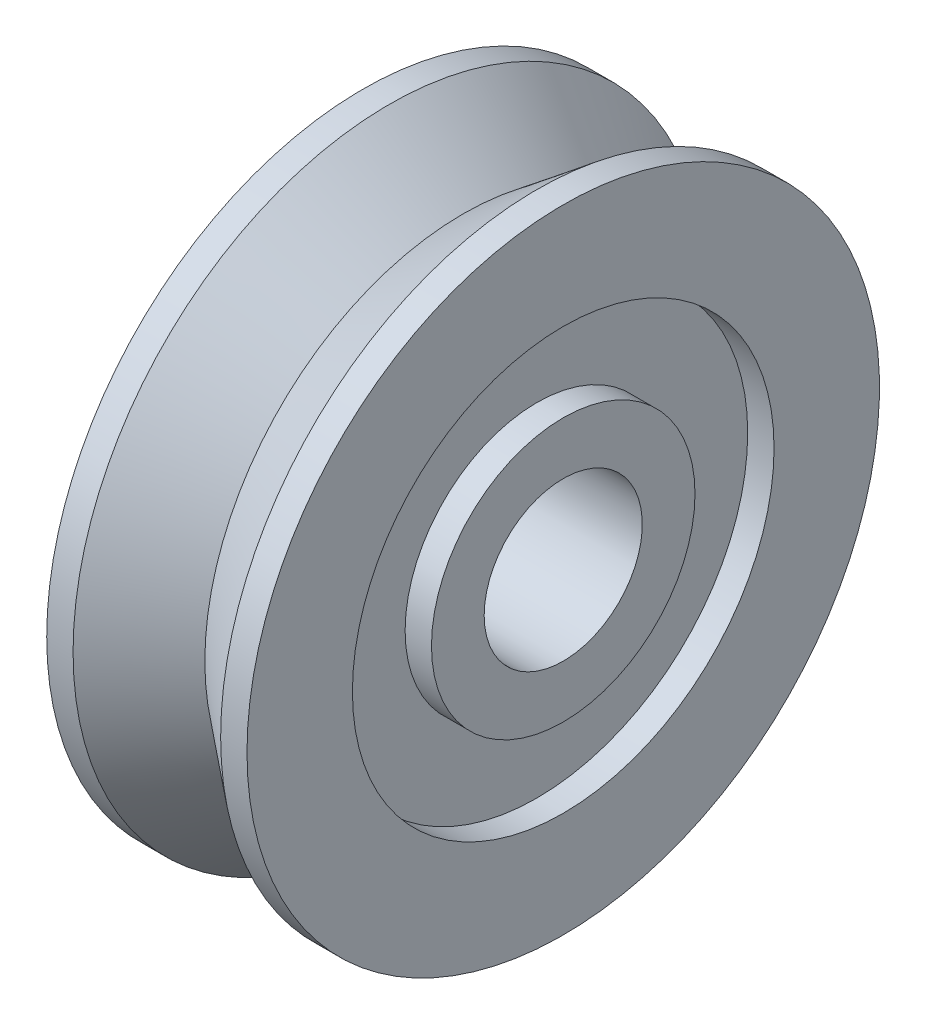
ISO-10303-21;
HEADER;
FILE_DESCRIPTION(('STEP AP214'),'2;1');
FILE_NAME('part.step','',(''),(''),'','','');
FILE_SCHEMA(('AUTOMOTIVE_DESIGN { 1 0 10303 214 1 1 1 1 }'));
ENDSEC;
DATA;
#1=APPLICATION_CONTEXT('core data for automotive mechanical design processes');
#2=APPLICATION_PROTOCOL_DEFINITION('international standard','automotive_design',2000,#1);
#3=PRODUCT_CONTEXT('',#1,'mechanical');
#4=PRODUCT('Part','Part','',(#3));
#5=PRODUCT_RELATED_PRODUCT_CATEGORY('part','',(#4));
#6=PRODUCT_DEFINITION_FORMATION('','',#4);
#7=PRODUCT_DEFINITION_CONTEXT('part definition',#1,'design');
#8=PRODUCT_DEFINITION('design','',#6,#7);
#9=PRODUCT_DEFINITION_SHAPE('','',#8);
#10=(LENGTH_UNIT() NAMED_UNIT(*) SI_UNIT(.MILLI.,.METRE.));
#11=(NAMED_UNIT(*) PLANE_ANGLE_UNIT() SI_UNIT($,.RADIAN.));
#12=(NAMED_UNIT(*) SI_UNIT($,.STERADIAN.) SOLID_ANGLE_UNIT());
#13=UNCERTAINTY_MEASURE_WITH_UNIT(LENGTH_MEASURE(1.E-05),#10,'distance_accuracy_value','');
#14=(GEOMETRIC_REPRESENTATION_CONTEXT(3) GLOBAL_UNCERTAINTY_ASSIGNED_CONTEXT((#13)) GLOBAL_UNIT_ASSIGNED_CONTEXT((#10,
#11,#12)) REPRESENTATION_CONTEXT('',''));
#15=CARTESIAN_POINT('',(0.,0.,0.));
#16=DIRECTION('',(0.,0.,1.));
#17=DIRECTION('',(1.,0.,0.));
#18=AXIS2_PLACEMENT_3D('',#15,#16,#17);
#19=CARTESIAN_POINT('',(1.9,1.5,0.));
#20=DIRECTION('',(-1.,0.,0.));
#21=DIRECTION('',(0.,0.,1.));
#22=AXIS2_PLACEMENT_3D('',#19,#20,#21);
#23=PLANE('',#22);
#24=CARTESIAN_POINT('',(1.9,0.,0.));
#25=DIRECTION('',(-1.,0.,0.));
#26=DIRECTION('',(0.,0.,1.));
#27=AXIS2_PLACEMENT_3D('',#24,#25,#26);
#28=CIRCLE('',#27,2.5);
#29=CARTESIAN_POINT('',(1.9,0.,2.5));
#30=VERTEX_POINT('',#29);
#31=EDGE_CURVE('E10',#30,#30,#28,.T.);
#32=ORIENTED_EDGE('',*,*,#31,.F.);
#33=EDGE_LOOP('',(#32));
#34=FACE_BOUND('',#33,.T.);
#35=CARTESIAN_POINT('',(1.9,0.,0.));
#36=DIRECTION('',(-1.,0.,0.));
#37=DIRECTION('',(0.,0.,1.));
#38=AXIS2_PLACEMENT_3D('',#35,#36,#37);
#39=CIRCLE('',#38,1.5);
#40=CARTESIAN_POINT('',(1.9,0.,1.5));
#41=VERTEX_POINT('',#40);
#42=EDGE_CURVE('E82',#41,#41,#39,.T.);
#43=ORIENTED_EDGE('',*,*,#42,.T.);
#44=EDGE_LOOP('',(#43));
#45=FACE_BOUND('',#44,.T.);
#46=ADVANCED_FACE('F33',(#34,#45),#23,.F.);
#47=CARTESIAN_POINT('',(0.,0.,0.));
#48=DIRECTION('',(-1.,0.,0.));
#49=DIRECTION('',(0.,0.,1.));
#50=AXIS2_PLACEMENT_3D('',#47,#48,#49);
#51=CYLINDRICAL_SURFACE('',#50,2.5);
#52=CARTESIAN_POINT('',(1.4,0.,0.));
#53=DIRECTION('',(-1.,0.,0.));
#54=DIRECTION('',(0.,0.,1.));
#55=AXIS2_PLACEMENT_3D('',#52,#53,#54);
#56=CIRCLE('',#55,2.5);
#57=CARTESIAN_POINT('',(1.4,0.,2.5));
#58=VERTEX_POINT('',#57);
#59=EDGE_CURVE('E39',#58,#58,#56,.T.);
#60=ORIENTED_EDGE('',*,*,#59,.F.);
#61=EDGE_LOOP('',(#60));
#62=FACE_BOUND('',#61,.T.);
#63=ORIENTED_EDGE('',*,*,#31,.T.);
#64=EDGE_LOOP('',(#63));
#65=FACE_BOUND('',#64,.T.);
#66=ADVANCED_FACE('F161',(#62,#65),#51,.T.);
#67=CARTESIAN_POINT('',(1.4,2.5,0.));
#68=DIRECTION('',(-1.,0.,0.));
#69=DIRECTION('',(0.,0.,1.));
#70=AXIS2_PLACEMENT_3D('',#67,#68,#69);
#71=PLANE('',#70);
#72=CARTESIAN_POINT('',(1.4,0.,0.));
#73=DIRECTION('',(-1.,0.,0.));
#74=DIRECTION('',(0.,0.,1.));
#75=AXIS2_PLACEMENT_3D('',#72,#73,#74);
#76=CIRCLE('',#75,4.);
#77=CARTESIAN_POINT('',(1.4,0.,4.));
#78=VERTEX_POINT('',#77);
#79=EDGE_CURVE('E43',#78,#78,#76,.T.);
#80=ORIENTED_EDGE('',*,*,#79,.F.);
#81=EDGE_LOOP('',(#80));
#82=FACE_BOUND('',#81,.T.);
#83=ORIENTED_EDGE('',*,*,#59,.T.);
#84=EDGE_LOOP('',(#83));
#85=FACE_BOUND('',#84,.T.);
#86=ADVANCED_FACE('F156',(#82,#85),#71,.F.);
#87=CARTESIAN_POINT('',(0.,0.,0.));
#88=DIRECTION('',(-1.,0.,0.));
#89=DIRECTION('',(0.,0.,1.));
#90=AXIS2_PLACEMENT_3D('',#87,#88,#89);
#91=CYLINDRICAL_SURFACE('',#90,4.);
#92=CARTESIAN_POINT('',(1.9,0.,0.));
#93=DIRECTION('',(-1.,0.,0.));
#94=DIRECTION('',(0.,0.,1.));
#95=AXIS2_PLACEMENT_3D('',#92,#93,#94);
#96=CIRCLE('',#95,4.);
#97=CARTESIAN_POINT('',(1.9,0.,4.));
#98=VERTEX_POINT('',#97);
#99=EDGE_CURVE('E47',#98,#98,#96,.T.);
#100=ORIENTED_EDGE('',*,*,#99,.F.);
#101=EDGE_LOOP('',(#100));
#102=FACE_BOUND('',#101,.T.);
#103=ORIENTED_EDGE('',*,*,#79,.T.);
#104=EDGE_LOOP('',(#103));
#105=FACE_BOUND('',#104,.T.);
#106=ADVANCED_FACE('F150',(#102,#105),#91,.F.);
#107=CARTESIAN_POINT('',(1.9,4.,0.));
#108=DIRECTION('',(-1.,0.,0.));
#109=DIRECTION('',(0.,0.,1.));
#110=AXIS2_PLACEMENT_3D('',#107,#108,#109);
#111=PLANE('',#110);
#112=CARTESIAN_POINT('',(1.9,0.,0.));
#113=DIRECTION('',(-1.,0.,0.));
#114=DIRECTION('',(0.,0.,1.));
#115=AXIS2_PLACEMENT_3D('',#112,#113,#114);
#116=CIRCLE('',#115,6.);
#117=CARTESIAN_POINT('',(1.9,0.,6.));
#118=VERTEX_POINT('',#117);
#119=EDGE_CURVE('E52',#118,#118,#116,.T.);
#120=ORIENTED_EDGE('',*,*,#119,.F.);
#121=EDGE_LOOP('',(#120));
#122=FACE_BOUND('',#121,.T.);
#123=ORIENTED_EDGE('',*,*,#99,.T.);
#124=EDGE_LOOP('',(#123));
#125=FACE_BOUND('',#124,.T.);
#126=ADVANCED_FACE('F144',(#122,#125),#111,.F.);
#127=CARTESIAN_POINT('',(0.,0.,0.));
#128=DIRECTION('',(-1.,0.,0.));
#129=DIRECTION('',(0.,0.,1.));
#130=AXIS2_PLACEMENT_3D('',#127,#128,#129);
#131=CYLINDRICAL_SURFACE('',#130,6.);
#132=CARTESIAN_POINT('',(1.4,0.,0.));
#133=DIRECTION('',(-1.,0.,0.));
#134=DIRECTION('',(0.,0.,1.));
#135=AXIS2_PLACEMENT_3D('',#132,#133,#134);
#136=CIRCLE('',#135,6.);
#137=CARTESIAN_POINT('',(1.4,0.,6.));
#138=VERTEX_POINT('',#137);
#139=EDGE_CURVE('E55',#138,#138,#136,.T.);
#140=ORIENTED_EDGE('',*,*,#139,.F.);
#141=EDGE_LOOP('',(#140));
#142=FACE_BOUND('',#141,.T.);
#143=ORIENTED_EDGE('',*,*,#119,.T.);
#144=EDGE_LOOP('',(#143));
#145=FACE_BOUND('',#144,.T.);
#146=ADVANCED_FACE('F138',(#142,#145),#131,.T.);
#147=CARTESIAN_POINT('',(1.4,0.,0.));
#148=DIRECTION('',(1.,0.,0.));
#149=DIRECTION('',(0.,0.,-1.));
#150=AXIS2_PLACEMENT_3D('',#147,#148,#149);
#151=CONICAL_SURFACE('',#150,6.,0.66596923737911);
#152=CARTESIAN_POINT('',(0.,0.,0.));
#153=DIRECTION('',(-1.,0.,0.));
#154=DIRECTION('',(0.,0.,1.));
#155=AXIS2_PLACEMENT_3D('',#152,#153,#154);
#156=CIRCLE('',#155,4.9);
#157=CARTESIAN_POINT('',(0.,0.,4.9));
#158=VERTEX_POINT('',#157);
#159=EDGE_CURVE('E58',#158,#158,#156,.T.);
#160=ORIENTED_EDGE('',*,*,#159,.F.);
#161=EDGE_LOOP('',(#160));
#162=FACE_BOUND('',#161,.T.);
#163=ORIENTED_EDGE('',*,*,#139,.T.);
#164=EDGE_LOOP('',(#163));
#165=FACE_BOUND('',#164,.T.);
#166=ADVANCED_FACE('F132',(#162,#165),#151,.T.);
#167=CARTESIAN_POINT('',(0.,0.,0.));
#168=DIRECTION('',(-1.,0.,0.));
#169=DIRECTION('',(0.,0.,1.));
#170=AXIS2_PLACEMENT_3D('',#167,#168,#169);
#171=CONICAL_SURFACE('',#170,4.9,0.66596923737911);
#172=CARTESIAN_POINT('',(-1.4,0.,0.));
#173=DIRECTION('',(-1.,0.,0.));
#174=DIRECTION('',(0.,0.,1.));
#175=AXIS2_PLACEMENT_3D('',#172,#173,#174);
#176=CIRCLE('',#175,6.);
#177=CARTESIAN_POINT('',(-1.4,0.,6.));
#178=VERTEX_POINT('',#177);
#179=EDGE_CURVE('E61',#178,#178,#176,.T.);
#180=ORIENTED_EDGE('',*,*,#179,.F.);
#181=EDGE_LOOP('',(#180));
#182=FACE_BOUND('',#181,.T.);
#183=ORIENTED_EDGE('',*,*,#159,.T.);
#184=EDGE_LOOP('',(#183));
#185=FACE_BOUND('',#184,.T.);
#186=ADVANCED_FACE('F126',(#182,#185),#171,.T.);
#187=CARTESIAN_POINT('',(0.,0.,0.));
#188=DIRECTION('',(-1.,0.,0.));
#189=DIRECTION('',(0.,0.,1.));
#190=AXIS2_PLACEMENT_3D('',#187,#188,#189);
#191=CYLINDRICAL_SURFACE('',#190,6.);
#192=CARTESIAN_POINT('',(-1.9,0.,0.));
#193=DIRECTION('',(-1.,0.,0.));
#194=DIRECTION('',(0.,0.,1.));
#195=AXIS2_PLACEMENT_3D('',#192,#193,#194);
#196=CIRCLE('',#195,6.);
#197=CARTESIAN_POINT('',(-1.9,0.,6.));
#198=VERTEX_POINT('',#197);
#199=EDGE_CURVE('E64',#198,#198,#196,.T.);
#200=ORIENTED_EDGE('',*,*,#199,.F.);
#201=EDGE_LOOP('',(#200));
#202=FACE_BOUND('',#201,.T.);
#203=ORIENTED_EDGE('',*,*,#179,.T.);
#204=EDGE_LOOP('',(#203));
#205=FACE_BOUND('',#204,.T.);
#206=ADVANCED_FACE('F120',(#202,#205),#191,.T.);
#207=CARTESIAN_POINT('',(-1.9,6.,0.));
#208=DIRECTION('',(1.,0.,0.));
#209=DIRECTION('',(0.,0.,-1.));
#210=AXIS2_PLACEMENT_3D('',#207,#208,#209);
#211=PLANE('',#210);
#212=CARTESIAN_POINT('',(-1.9,0.,0.));
#213=DIRECTION('',(-1.,0.,0.));
#214=DIRECTION('',(0.,0.,1.));
#215=AXIS2_PLACEMENT_3D('',#212,#213,#214);
#216=CIRCLE('',#215,4.);
#217=CARTESIAN_POINT('',(-1.9,0.,4.));
#218=VERTEX_POINT('',#217);
#219=EDGE_CURVE('E67',#218,#218,#216,.T.);
#220=ORIENTED_EDGE('',*,*,#219,.F.);
#221=EDGE_LOOP('',(#220));
#222=FACE_BOUND('',#221,.T.);
#223=ORIENTED_EDGE('',*,*,#199,.T.);
#224=EDGE_LOOP('',(#223));
#225=FACE_BOUND('',#224,.T.);
#226=ADVANCED_FACE('F114',(#222,#225),#211,.F.);
#227=CARTESIAN_POINT('',(0.,0.,0.));
#228=DIRECTION('',(-1.,0.,0.));
#229=DIRECTION('',(0.,0.,1.));
#230=AXIS2_PLACEMENT_3D('',#227,#228,#229);
#231=CYLINDRICAL_SURFACE('',#230,4.);
#232=CARTESIAN_POINT('',(-1.4,0.,0.));
#233=DIRECTION('',(-1.,0.,0.));
#234=DIRECTION('',(0.,0.,1.));
#235=AXIS2_PLACEMENT_3D('',#232,#233,#234);
#236=CIRCLE('',#235,4.);
#237=CARTESIAN_POINT('',(-1.4,0.,4.));
#238=VERTEX_POINT('',#237);
#239=EDGE_CURVE('E70',#238,#238,#236,.T.);
#240=ORIENTED_EDGE('',*,*,#239,.F.);
#241=EDGE_LOOP('',(#240));
#242=FACE_BOUND('',#241,.T.);
#243=ORIENTED_EDGE('',*,*,#219,.T.);
#244=EDGE_LOOP('',(#243));
#245=FACE_BOUND('',#244,.T.);
#246=ADVANCED_FACE('F108',(#242,#245),#231,.F.);
#247=CARTESIAN_POINT('',(-1.4,4.,0.));
#248=DIRECTION('',(1.,0.,0.));
#249=DIRECTION('',(0.,0.,-1.));
#250=AXIS2_PLACEMENT_3D('',#247,#248,#249);
#251=PLANE('',#250);
#252=CARTESIAN_POINT('',(-1.4,0.,0.));
#253=DIRECTION('',(-1.,0.,0.));
#254=DIRECTION('',(0.,0.,1.));
#255=AXIS2_PLACEMENT_3D('',#252,#253,#254);
#256=CIRCLE('',#255,2.5);
#257=CARTESIAN_POINT('',(-1.4,0.,2.5));
#258=VERTEX_POINT('',#257);
#259=EDGE_CURVE('E73',#258,#258,#256,.T.);
#260=ORIENTED_EDGE('',*,*,#259,.F.);
#261=EDGE_LOOP('',(#260));
#262=FACE_BOUND('',#261,.T.);
#263=ORIENTED_EDGE('',*,*,#239,.T.);
#264=EDGE_LOOP('',(#263));
#265=FACE_BOUND('',#264,.T.);
#266=ADVANCED_FACE('F102',(#262,#265),#251,.F.);
#267=CARTESIAN_POINT('',(0.,0.,0.));
#268=DIRECTION('',(-1.,0.,0.));
#269=DIRECTION('',(0.,0.,1.));
#270=AXIS2_PLACEMENT_3D('',#267,#268,#269);
#271=CYLINDRICAL_SURFACE('',#270,2.5);
#272=CARTESIAN_POINT('',(-1.9,0.,0.));
#273=DIRECTION('',(-1.,0.,0.));
#274=DIRECTION('',(0.,0.,1.));
#275=AXIS2_PLACEMENT_3D('',#272,#273,#274);
#276=CIRCLE('',#275,2.5);
#277=CARTESIAN_POINT('',(-1.9,0.,2.5));
#278=VERTEX_POINT('',#277);
#279=EDGE_CURVE('E76',#278,#278,#276,.T.);
#280=ORIENTED_EDGE('',*,*,#279,.F.);
#281=EDGE_LOOP('',(#280));
#282=FACE_BOUND('',#281,.T.);
#283=ORIENTED_EDGE('',*,*,#259,.T.);
#284=EDGE_LOOP('',(#283));
#285=FACE_BOUND('',#284,.T.);
#286=ADVANCED_FACE('F96',(#282,#285),#271,.T.);
#287=CARTESIAN_POINT('',(-1.9,2.5,0.));
#288=DIRECTION('',(1.,0.,0.));
#289=DIRECTION('',(0.,0.,-1.));
#290=AXIS2_PLACEMENT_3D('',#287,#288,#289);
#291=PLANE('',#290);
#292=CARTESIAN_POINT('',(-1.9,0.,0.));
#293=DIRECTION('',(-1.,0.,0.));
#294=DIRECTION('',(0.,0.,1.));
#295=AXIS2_PLACEMENT_3D('',#292,#293,#294);
#296=CIRCLE('',#295,1.5);
#297=CARTESIAN_POINT('',(-1.9,0.,1.5));
#298=VERTEX_POINT('',#297);
#299=EDGE_CURVE('E79',#298,#298,#296,.T.);
#300=ORIENTED_EDGE('',*,*,#299,.F.);
#301=EDGE_LOOP('',(#300));
#302=FACE_BOUND('',#301,.T.);
#303=ORIENTED_EDGE('',*,*,#279,.T.);
#304=EDGE_LOOP('',(#303));
#305=FACE_BOUND('',#304,.T.);
#306=ADVANCED_FACE('F90',(#302,#305),#291,.F.);
#307=CARTESIAN_POINT('',(0.,0.,0.));
#308=DIRECTION('',(-1.,0.,0.));
#309=DIRECTION('',(0.,0.,1.));
#310=AXIS2_PLACEMENT_3D('',#307,#308,#309);
#311=CYLINDRICAL_SURFACE('',#310,1.5);
#312=ORIENTED_EDGE('',*,*,#42,.F.);
#313=EDGE_LOOP('',(#312));
#314=FACE_BOUND('',#313,.T.);
#315=ORIENTED_EDGE('',*,*,#299,.T.);
#316=EDGE_LOOP('',(#315));
#317=FACE_BOUND('',#316,.T.);
#318=ADVANCED_FACE('F87',(#314,#317),#311,.F.);
#319=CLOSED_SHELL('',(#46,#66,#86,#106,#126,#146,#166,#186,#206,#226,#246,#266,#286,#306,#318));
#320=MANIFOLD_SOLID_BREP('B2',#319);
#321=ADVANCED_BREP_SHAPE_REPRESENTATION('',(#18,#320),#14);
#322=SHAPE_DEFINITION_REPRESENTATION(#9,#321);
ENDSEC;
END-ISO-10303-21;
